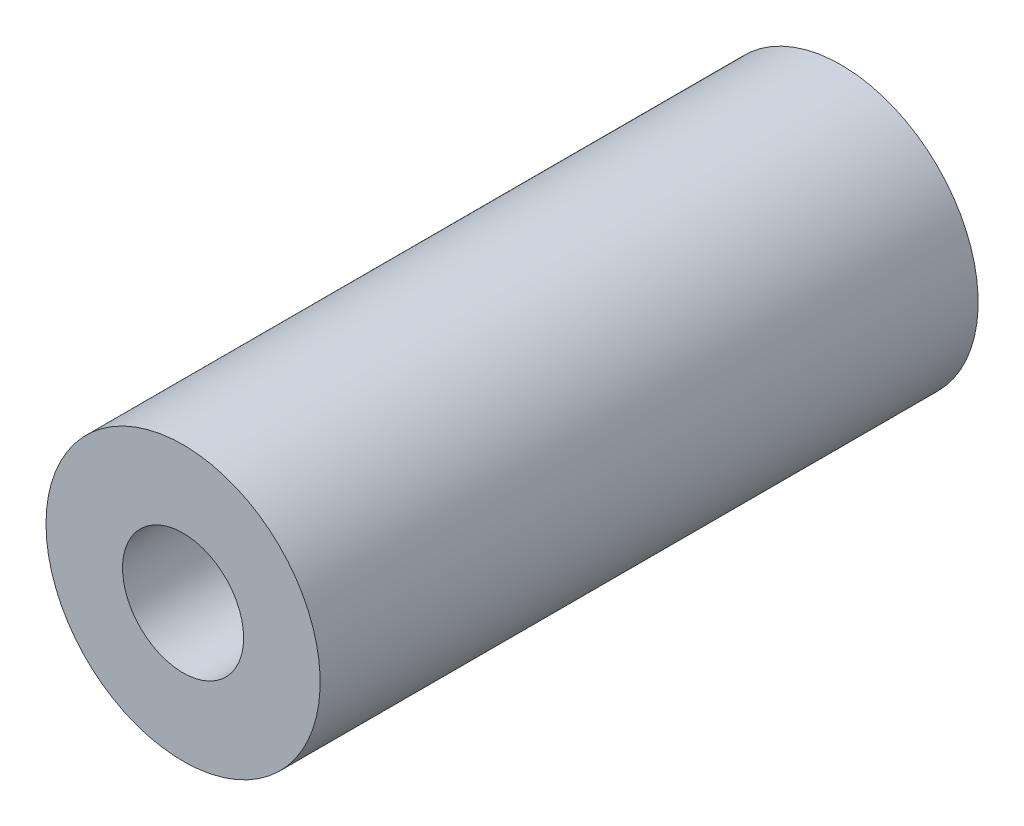
ISO-10303-21;
HEADER;
FILE_DESCRIPTION(('STEP AP214'),'2;1');
FILE_NAME('part.step','',(''),(''),'','','');
FILE_SCHEMA(('AUTOMOTIVE_DESIGN { 1 0 10303 214 1 1 1 1 }'));
ENDSEC;
DATA;
#1=APPLICATION_CONTEXT('core data for automotive mechanical design processes');
#2=APPLICATION_PROTOCOL_DEFINITION('international standard','automotive_design',2000,#1);
#3=PRODUCT_CONTEXT('',#1,'mechanical');
#4=PRODUCT('Part','Part','',(#3));
#5=PRODUCT_RELATED_PRODUCT_CATEGORY('part','',(#4));
#6=PRODUCT_DEFINITION_FORMATION('','',#4);
#7=PRODUCT_DEFINITION_CONTEXT('part definition',#1,'design');
#8=PRODUCT_DEFINITION('design','',#6,#7);
#9=PRODUCT_DEFINITION_SHAPE('','',#8);
#10=(LENGTH_UNIT() NAMED_UNIT(*) SI_UNIT(.MILLI.,.METRE.));
#11=(NAMED_UNIT(*) PLANE_ANGLE_UNIT() SI_UNIT($,.RADIAN.));
#12=(NAMED_UNIT(*) SI_UNIT($,.STERADIAN.) SOLID_ANGLE_UNIT());
#13=UNCERTAINTY_MEASURE_WITH_UNIT(LENGTH_MEASURE(1.E-05),#10,'distance_accuracy_value','');
#14=(GEOMETRIC_REPRESENTATION_CONTEXT(3) GLOBAL_UNCERTAINTY_ASSIGNED_CONTEXT((#13)) GLOBAL_UNIT_ASSIGNED_CONTEXT((#10,
#11,#12)) REPRESENTATION_CONTEXT('',''));
#15=CARTESIAN_POINT('',(0.,0.,0.));
#16=DIRECTION('',(0.,0.,1.));
#17=DIRECTION('',(1.,0.,0.));
#18=AXIS2_PLACEMENT_3D('',#15,#16,#17);
#19=CARTESIAN_POINT('',(0.,0.,9.525));
#20=DIRECTION('',(0.,0.,-1.));
#21=DIRECTION('',(-1.,0.,0.));
#22=AXIS2_PLACEMENT_3D('',#19,#20,#21);
#23=CYLINDRICAL_SURFACE('',#22,3.96875);
#24=CARTESIAN_POINT('',(0.,0.,9.525));
#25=DIRECTION('',(0.,0.,1.));
#26=DIRECTION('',(1.,0.,0.));
#27=AXIS2_PLACEMENT_3D('',#24,#25,#26);
#28=CIRCLE('',#27,3.96875);
#29=CARTESIAN_POINT('',(-3.96875,0.,9.525));
#30=VERTEX_POINT('',#29);
#31=EDGE_CURVE('E10',#30,#30,#28,.T.);
#32=CARTESIAN_POINT('',(0.,0.,-9.525));
#33=DIRECTION('',(0.,0.,1.));
#34=DIRECTION('',(1.,0.,0.));
#35=AXIS2_PLACEMENT_3D('',#32,#33,#34);
#36=CIRCLE('',#35,3.96875);
#37=CARTESIAN_POINT('',(-3.96875,0.,-9.525));
#38=VERTEX_POINT('',#37);
#39=EDGE_CURVE('E39',#38,#38,#36,.T.);
#40=CARTESIAN_POINT('',(-3.96875,0.,9.525));
#41=CARTESIAN_POINT('',(-3.96875,0.,9.3265625));
#42=CARTESIAN_POINT('',(-3.96875,0.,9.128125));
#43=CARTESIAN_POINT('',(-3.96875,0.,8.73125));
#44=CARTESIAN_POINT('',(-3.96875,0.,8.5328125));
#45=CARTESIAN_POINT('',(-3.96875,0.,8.1359375));
#46=CARTESIAN_POINT('',(-3.96875,0.,7.9375));
#47=CARTESIAN_POINT('',(-3.96875,0.,7.540625));
#48=CARTESIAN_POINT('',(-3.96875,0.,7.3421875));
#49=CARTESIAN_POINT('',(-3.96875,0.,6.9453125));
#50=CARTESIAN_POINT('',(-3.96875,0.,6.746875));
#51=CARTESIAN_POINT('',(-3.96875,0.,6.35));
#52=CARTESIAN_POINT('',(-3.96875,0.,6.1515625));
#53=CARTESIAN_POINT('',(-3.96875,0.,5.7546875));
#54=CARTESIAN_POINT('',(-3.96875,0.,5.55625));
#55=CARTESIAN_POINT('',(-3.96875,0.,5.159375));
#56=CARTESIAN_POINT('',(-3.96875,0.,4.9609375));
#57=CARTESIAN_POINT('',(-3.96875,0.,4.5640625));
#58=CARTESIAN_POINT('',(-3.96875,0.,4.365625));
#59=CARTESIAN_POINT('',(-3.96875,0.,3.96875));
#60=CARTESIAN_POINT('',(-3.96875,0.,3.7703125));
#61=CARTESIAN_POINT('',(-3.96875,0.,3.3734375));
#62=CARTESIAN_POINT('',(-3.96875,0.,3.175));
#63=CARTESIAN_POINT('',(-3.96875,0.,2.778125));
#64=CARTESIAN_POINT('',(-3.96875,0.,2.5796875));
#65=CARTESIAN_POINT('',(-3.96875,0.,2.1828125));
#66=CARTESIAN_POINT('',(-3.96875,0.,1.984375));
#67=CARTESIAN_POINT('',(-3.96875,0.,1.5875));
#68=CARTESIAN_POINT('',(-3.96875,0.,1.3890625));
#69=CARTESIAN_POINT('',(-3.96875,0.,0.992187500000001));
#70=CARTESIAN_POINT('',(-3.96875,0.,0.793750000000001));
#71=CARTESIAN_POINT('',(-3.96875,0.,0.396875));
#72=CARTESIAN_POINT('',(-3.96875,0.,0.1984375));
#73=CARTESIAN_POINT('',(-3.96875,0.,-0.1984375));
#74=CARTESIAN_POINT('',(-3.96875,0.,-0.396875));
#75=CARTESIAN_POINT('',(-3.96875,0.,-0.793750000000001));
#76=CARTESIAN_POINT('',(-3.96875,0.,-0.992187500000001));
#77=CARTESIAN_POINT('',(-3.96875,0.,-1.3890625));
#78=CARTESIAN_POINT('',(-3.96875,0.,-1.5875));
#79=CARTESIAN_POINT('',(-3.96875,0.,-1.984375));
#80=CARTESIAN_POINT('',(-3.96875,0.,-2.1828125));
#81=CARTESIAN_POINT('',(-3.96875,0.,-2.5796875));
#82=CARTESIAN_POINT('',(-3.96875,0.,-2.778125));
#83=CARTESIAN_POINT('',(-3.96875,0.,-3.175));
#84=CARTESIAN_POINT('',(-3.96875,0.,-3.3734375));
#85=CARTESIAN_POINT('',(-3.96875,0.,-3.7703125));
#86=CARTESIAN_POINT('',(-3.96875,0.,-3.96875));
#87=CARTESIAN_POINT('',(-3.96875,0.,-4.365625));
#88=CARTESIAN_POINT('',(-3.96875,0.,-4.5640625));
#89=CARTESIAN_POINT('',(-3.96875,0.,-4.9609375));
#90=CARTESIAN_POINT('',(-3.96875,0.,-5.159375));
#91=CARTESIAN_POINT('',(-3.96875,0.,-5.55625));
#92=CARTESIAN_POINT('',(-3.96875,0.,-5.7546875));
#93=CARTESIAN_POINT('',(-3.96875,0.,-6.1515625));
#94=CARTESIAN_POINT('',(-3.96875,0.,-6.35));
#95=CARTESIAN_POINT('',(-3.96875,0.,-6.746875));
#96=CARTESIAN_POINT('',(-3.96875,0.,-6.9453125));
#97=CARTESIAN_POINT('',(-3.96875,0.,-7.3421875));
#98=CARTESIAN_POINT('',(-3.96875,0.,-7.540625));
#99=CARTESIAN_POINT('',(-3.96875,0.,-7.9375));
#100=CARTESIAN_POINT('',(-3.96875,0.,-8.1359375));
#101=CARTESIAN_POINT('',(-3.96875,0.,-8.5328125));
#102=CARTESIAN_POINT('',(-3.96875,0.,-8.73125));
#103=CARTESIAN_POINT('',(-3.96875,0.,-9.128125));
#104=CARTESIAN_POINT('',(-3.96875,0.,-9.3265625));
#105=CARTESIAN_POINT('',(-3.96875,0.,-9.525));
#106=B_SPLINE_CURVE_WITH_KNOTS('',3,(#40,#41,#42,#43,#44,#45,#46,#47,#48,#49,#50,#51,#52,#53,
#54,#55,#56,#57,#58,#59,#60,#61,#62,#63,#64,#65,#66,#67,#68,#69,#70,#71,#72,#73,#74,#75,#76,#77,
#78,#79,#80,#81,#82,#83,#84,#85,#86,#87,#88,#89,#90,#91,#92,#93,#94,#95,#96,#97,#98,#99,#100,
#101,#102,#103,#104,#105),.UNSPECIFIED.,.F.,.F.,(4,2,2,2,2,2,2,2,2,2,2,2,2,2,2,2,2,2,2,2,2,2,2,
2,2,2,2,2,2,2,2,2,4),(0.,0.5953125,1.190625,1.7859375,2.38125,2.9765625,3.571875,4.1671875,
4.7625,5.3578125,5.953125,6.5484375,7.14375,7.7390625,8.334375,8.9296875,9.525,10.1203125,
10.715625,11.3109375,11.90625,12.5015625,13.096875,13.6921875,14.2875,14.8828125,15.478125,
16.0734375,16.66875,17.2640625,17.859375,18.4546875,19.05),.UNSPECIFIED.);
#107=EDGE_CURVE('BSEAM32',#30,#38,#106,.T.);
#108=ORIENTED_EDGE('',*,*,#31,.F.);
#109=ORIENTED_EDGE('',*,*,#39,.T.);
#110=ORIENTED_EDGE('',*,*,#107,.T.);
#111=ORIENTED_EDGE('',*,*,#107,.F.);
#112=EDGE_LOOP('',(#108,#110,#109,#111));
#113=FACE_BOUND('',#112,.T.);
#114=ADVANCED_FACE('F32',(#113),#23,.T.);
#115=CARTESIAN_POINT('',(0.,0.,9.525));
#116=DIRECTION('',(0.,0.,1.));
#117=DIRECTION('',(1.,0.,0.));
#118=AXIS2_PLACEMENT_3D('',#115,#116,#117);
#119=PLANE('',#118);
#120=CARTESIAN_POINT('',(0.,0.,9.525));
#121=DIRECTION('',(0.,0.,1.));
#122=DIRECTION('',(1.,0.,0.));
#123=AXIS2_PLACEMENT_3D('',#120,#121,#122);
#124=CIRCLE('',#123,1.7526);
#125=CARTESIAN_POINT('',(1.7526,0.,9.525));
#126=VERTEX_POINT('',#125);
#127=EDGE_CURVE('E66',#126,#126,#124,.T.);
#128=ORIENTED_EDGE('',*,*,#127,.F.);
#129=EDGE_LOOP('',(#128));
#130=FACE_BOUND('',#129,.T.);
#131=ORIENTED_EDGE('',*,*,#31,.T.);
#132=EDGE_LOOP('',(#131));
#133=FACE_BOUND('',#132,.T.);
#134=ADVANCED_FACE('F72',(#130,#133),#119,.T.);
#135=CARTESIAN_POINT('',(0.,0.,-9.525));
#136=DIRECTION('',(0.,0.,1.));
#137=DIRECTION('',(1.,0.,0.));
#138=AXIS2_PLACEMENT_3D('',#135,#136,#137);
#139=PLANE('',#138);
#140=CARTESIAN_POINT('',(0.,0.,-9.525));
#141=DIRECTION('',(0.,0.,-1.));
#142=DIRECTION('',(-1.,0.,0.));
#143=AXIS2_PLACEMENT_3D('',#140,#141,#142);
#144=CIRCLE('',#143,1.7526);
#145=CARTESIAN_POINT('',(-1.7526,0.,-9.525));
#146=VERTEX_POINT('',#145);
#147=EDGE_CURVE('E54',#146,#146,#144,.T.);
#148=ORIENTED_EDGE('',*,*,#147,.F.);
#149=EDGE_LOOP('',(#148));
#150=FACE_BOUND('',#149,.T.);
#151=ORIENTED_EDGE('',*,*,#39,.F.);
#152=EDGE_LOOP('',(#151));
#153=FACE_BOUND('',#152,.T.);
#154=ADVANCED_FACE('F74',(#150,#153),#139,.F.);
#155=CARTESIAN_POINT('',(0.,0.,-0.127));
#156=DIRECTION('',(0.,0.,-1.));
#157=DIRECTION('',(-1.,0.,0.));
#158=AXIS2_PLACEMENT_3D('',#155,#156,#157);
#159=CONICAL_SURFACE('',#158,1.35255,1.02974425867665);
#160=CARTESIAN_POINT('',(0.,0.,0.));
#161=DIRECTION('',(0.,0.,1.));
#162=DIRECTION('',(1.,0.,0.));
#163=AXIS2_PLACEMENT_3D('',#160,#161,#162);
#164=CIRCLE('',#163,1.14118650574148);
#165=CARTESIAN_POINT('',(1.14118650574148,0.,0.));
#166=VERTEX_POINT('',#165);
#167=EDGE_CURVE('E35',#166,#166,#164,.T.);
#168=ORIENTED_EDGE('',*,*,#167,.T.);
#169=EDGE_LOOP('',(#168));
#170=FACE_BOUND('',#169,.T.);
#171=CARTESIAN_POINT('',(0.,0.,-0.127));
#172=DIRECTION('',(0.,0.,-1.));
#173=DIRECTION('',(-1.,0.,0.));
#174=AXIS2_PLACEMENT_3D('',#171,#172,#173);
#175=CIRCLE('',#174,1.35255);
#176=CARTESIAN_POINT('',(-1.35255,0.,-0.127));
#177=VERTEX_POINT('',#176);
#178=EDGE_CURVE('E44',#177,#177,#175,.T.);
#179=ORIENTED_EDGE('',*,*,#178,.T.);
#180=EDGE_LOOP('',(#179));
#181=FACE_BOUND('',#180,.T.);
#182=ADVANCED_FACE('F80',(#170,#181),#159,.F.);
#183=CARTESIAN_POINT('',(0.,0.,-9.525));
#184=DIRECTION('',(0.,0.,-1.));
#185=DIRECTION('',(-1.,0.,0.));
#186=AXIS2_PLACEMENT_3D('',#183,#184,#185);
#187=CYLINDRICAL_SURFACE('',#186,1.35255);
#188=ORIENTED_EDGE('',*,*,#178,.F.);
#189=EDGE_LOOP('',(#188));
#190=FACE_BOUND('',#189,.T.);
#191=CARTESIAN_POINT('',(0.,0.,-2.413));
#192=DIRECTION('',(0.,0.,-1.));
#193=DIRECTION('',(-1.,0.,0.));
#194=AXIS2_PLACEMENT_3D('',#191,#192,#193);
#195=CIRCLE('',#194,1.35255);
#196=CARTESIAN_POINT('',(-1.35255,0.,-2.413));
#197=VERTEX_POINT('',#196);
#198=EDGE_CURVE('E48',#197,#197,#195,.T.);
#199=ORIENTED_EDGE('',*,*,#198,.T.);
#200=EDGE_LOOP('',(#199));
#201=FACE_BOUND('',#200,.T.);
#202=ADVANCED_FACE('F86',(#190,#201),#187,.F.);
#203=CARTESIAN_POINT('',(1.35255,0.,-2.413));
#204=DIRECTION('',(0.,0.,1.));
#205=DIRECTION('',(1.,0.,0.));
#206=AXIS2_PLACEMENT_3D('',#203,#204,#205);
#207=PLANE('',#206);
#208=ORIENTED_EDGE('',*,*,#198,.F.);
#209=EDGE_LOOP('',(#208));
#210=FACE_BOUND('',#209,.T.);
#211=CARTESIAN_POINT('',(0.,0.,-2.413));
#212=DIRECTION('',(0.,0.,-1.));
#213=DIRECTION('',(-1.,0.,0.));
#214=AXIS2_PLACEMENT_3D('',#211,#212,#213);
#215=CIRCLE('',#214,1.7526);
#216=CARTESIAN_POINT('',(-1.7526,0.,-2.413));
#217=VERTEX_POINT('',#216);
#218=EDGE_CURVE('E51',#217,#217,#215,.T.);
#219=ORIENTED_EDGE('',*,*,#218,.T.);
#220=EDGE_LOOP('',(#219));
#221=FACE_BOUND('',#220,.T.);
#222=ADVANCED_FACE('F90',(#210,#221),#207,.F.);
#223=CARTESIAN_POINT('',(0.,0.,-9.525));
#224=DIRECTION('',(0.,0.,-1.));
#225=DIRECTION('',(-1.,0.,0.));
#226=AXIS2_PLACEMENT_3D('',#223,#224,#225);
#227=CYLINDRICAL_SURFACE('',#226,1.7526);
#228=ORIENTED_EDGE('',*,*,#218,.F.);
#229=EDGE_LOOP('',(#228));
#230=FACE_BOUND('',#229,.T.);
#231=ORIENTED_EDGE('',*,*,#147,.T.);
#232=EDGE_LOOP('',(#231));
#233=FACE_BOUND('',#232,.T.);
#234=ADVANCED_FACE('F94',(#230,#233),#227,.F.);
#235=CARTESIAN_POINT('',(0.,0.,0.127));
#236=DIRECTION('',(0.,0.,1.));
#237=DIRECTION('',(1.,0.,0.));
#238=AXIS2_PLACEMENT_3D('',#235,#236,#237);
#239=CONICAL_SURFACE('',#238,1.35255,1.02974425867665);
#240=CARTESIAN_POINT('',(0.,0.,0.127));
#241=DIRECTION('',(0.,0.,1.));
#242=DIRECTION('',(1.,0.,0.));
#243=AXIS2_PLACEMENT_3D('',#240,#241,#242);
#244=CIRCLE('',#243,1.35255);
#245=CARTESIAN_POINT('',(1.35255,0.,0.127));
#246=VERTEX_POINT('',#245);
#247=EDGE_CURVE('E57',#246,#246,#244,.T.);
#248=ORIENTED_EDGE('',*,*,#247,.T.);
#249=EDGE_LOOP('',(#248));
#250=FACE_BOUND('',#249,.T.);
#251=ORIENTED_EDGE('',*,*,#167,.F.);
#252=EDGE_LOOP('',(#251));
#253=FACE_BOUND('',#252,.T.);
#254=ADVANCED_FACE('F98',(#250,#253),#239,.F.);
#255=CARTESIAN_POINT('',(0.,0.,9.525));
#256=DIRECTION('',(0.,0.,1.));
#257=DIRECTION('',(1.,0.,0.));
#258=AXIS2_PLACEMENT_3D('',#255,#256,#257);
#259=CYLINDRICAL_SURFACE('',#258,1.35255);
#260=ORIENTED_EDGE('',*,*,#247,.F.);
#261=EDGE_LOOP('',(#260));
#262=FACE_BOUND('',#261,.T.);
#263=CARTESIAN_POINT('',(0.,0.,2.413));
#264=DIRECTION('',(0.,0.,1.));
#265=DIRECTION('',(1.,0.,0.));
#266=AXIS2_PLACEMENT_3D('',#263,#264,#265);
#267=CIRCLE('',#266,1.35255);
#268=CARTESIAN_POINT('',(1.35255,0.,2.413));
#269=VERTEX_POINT('',#268);
#270=EDGE_CURVE('E60',#269,#269,#267,.T.);
#271=ORIENTED_EDGE('',*,*,#270,.T.);
#272=EDGE_LOOP('',(#271));
#273=FACE_BOUND('',#272,.T.);
#274=ADVANCED_FACE('F102',(#262,#273),#259,.F.);
#275=CARTESIAN_POINT('',(1.35255,0.,2.413));
#276=DIRECTION('',(0.,0.,-1.));
#277=DIRECTION('',(-1.,0.,0.));
#278=AXIS2_PLACEMENT_3D('',#275,#276,#277);
#279=PLANE('',#278);
#280=ORIENTED_EDGE('',*,*,#270,.F.);
#281=EDGE_LOOP('',(#280));
#282=FACE_BOUND('',#281,.T.);
#283=CARTESIAN_POINT('',(0.,0.,2.413));
#284=DIRECTION('',(0.,0.,1.));
#285=DIRECTION('',(1.,0.,0.));
#286=AXIS2_PLACEMENT_3D('',#283,#284,#285);
#287=CIRCLE('',#286,1.7526);
#288=CARTESIAN_POINT('',(1.7526,0.,2.413));
#289=VERTEX_POINT('',#288);
#290=EDGE_CURVE('E63',#289,#289,#287,.T.);
#291=ORIENTED_EDGE('',*,*,#290,.T.);
#292=EDGE_LOOP('',(#291));
#293=FACE_BOUND('',#292,.T.);
#294=ADVANCED_FACE('F106',(#282,#293),#279,.F.);
#295=CARTESIAN_POINT('',(0.,0.,9.525));
#296=DIRECTION('',(0.,0.,1.));
#297=DIRECTION('',(1.,0.,0.));
#298=AXIS2_PLACEMENT_3D('',#295,#296,#297);
#299=CYLINDRICAL_SURFACE('',#298,1.7526);
#300=ORIENTED_EDGE('',*,*,#290,.F.);
#301=EDGE_LOOP('',(#300));
#302=FACE_BOUND('',#301,.T.);
#303=ORIENTED_EDGE('',*,*,#127,.T.);
#304=EDGE_LOOP('',(#303));
#305=FACE_BOUND('',#304,.T.);
#306=ADVANCED_FACE('F70',(#302,#305),#299,.F.);
#307=CLOSED_SHELL('',(#114,#134,#154,#182,#202,#222,#234,#254,#274,#294,#306));
#308=MANIFOLD_SOLID_BREP('B2',#307);
#309=ADVANCED_BREP_SHAPE_REPRESENTATION('',(#18,#308),#14);
#310=SHAPE_DEFINITION_REPRESENTATION(#9,#309);
ENDSEC;
END-ISO-10303-21;
